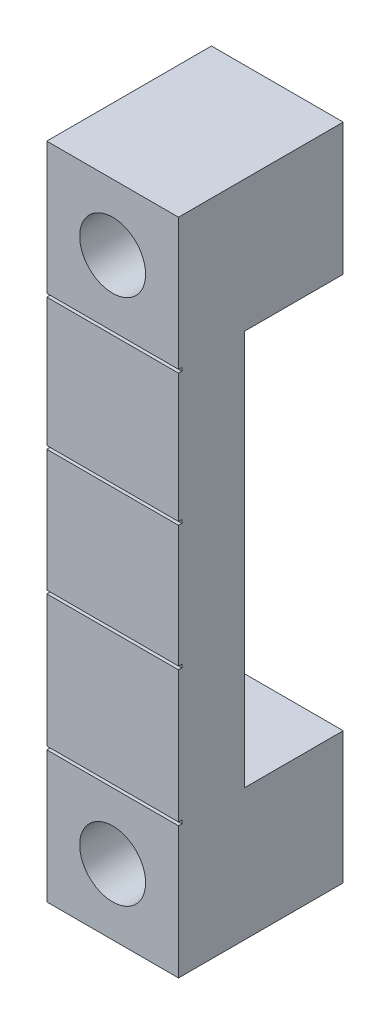
ISO-10303-21;
HEADER;
FILE_DESCRIPTION(('STEP AP214'),'2;1');
FILE_NAME('part.step','',(''),(''),'','','');
FILE_SCHEMA(('AUTOMOTIVE_DESIGN { 1 0 10303 214 1 1 1 1 }'));
ENDSEC;
DATA;
#1=APPLICATION_CONTEXT('core data for automotive mechanical design processes');
#2=APPLICATION_PROTOCOL_DEFINITION('international standard','automotive_design',2000,#1);
#3=PRODUCT_CONTEXT('',#1,'mechanical');
#4=PRODUCT('Part','Part','',(#3));
#5=PRODUCT_RELATED_PRODUCT_CATEGORY('part','',(#4));
#6=PRODUCT_DEFINITION_FORMATION('','',#4);
#7=PRODUCT_DEFINITION_CONTEXT('part definition',#1,'design');
#8=PRODUCT_DEFINITION('design','',#6,#7);
#9=PRODUCT_DEFINITION_SHAPE('','',#8);
#10=(LENGTH_UNIT() NAMED_UNIT(*) SI_UNIT(.MILLI.,.METRE.));
#11=(NAMED_UNIT(*) PLANE_ANGLE_UNIT() SI_UNIT($,.RADIAN.));
#12=(NAMED_UNIT(*) SI_UNIT($,.STERADIAN.) SOLID_ANGLE_UNIT());
#13=UNCERTAINTY_MEASURE_WITH_UNIT(LENGTH_MEASURE(1.E-05),#10,'distance_accuracy_value','');
#14=(GEOMETRIC_REPRESENTATION_CONTEXT(3) GLOBAL_UNCERTAINTY_ASSIGNED_CONTEXT((#13)) GLOBAL_UNIT_ASSIGNED_CONTEXT((#10,
#11,#12)) REPRESENTATION_CONTEXT('',''));
#15=CARTESIAN_POINT('',(0.,0.,0.));
#16=DIRECTION('',(0.,0.,1.));
#17=DIRECTION('',(1.,0.,0.));
#18=AXIS2_PLACEMENT_3D('',#15,#16,#17);
#19=CARTESIAN_POINT('',(0.,0.,10.));
#20=DIRECTION('',(0.,0.,1.));
#21=DIRECTION('',(1.,0.,0.));
#22=AXIS2_PLACEMENT_3D('',#19,#20,#21);
#23=PLANE('',#22);
#24=DIRECTION('',(-1.,0.,0.));
#25=VECTOR('',#24,1.);
#26=CARTESIAN_POINT('',(0.,-79.5,10.));
#27=LINE('',#26,#25);
#28=CARTESIAN_POINT('',(20.,-79.5,10.));
#29=VERTEX_POINT('',#28);
#30=CARTESIAN_POINT('',(0.,-79.5,10.));
#31=VERTEX_POINT('',#30);
#32=EDGE_CURVE('E218',#29,#31,#27,.T.);
#33=ORIENTED_EDGE('',*,*,#32,.F.);
#34=DIRECTION('',(0.,1.,0.));
#35=VECTOR('',#34,1.);
#36=CARTESIAN_POINT('',(20.,0.,10.));
#37=LINE('',#36,#35);
#38=CARTESIAN_POINT('',(20.,-59.5,10.));
#39=VERTEX_POINT('',#38);
#40=EDGE_CURVE('E373',#29,#39,#37,.T.);
#41=ORIENTED_EDGE('',*,*,#40,.T.);
#42=DIRECTION('',(1.,0.,0.));
#43=VECTOR('',#42,1.);
#44=CARTESIAN_POINT('',(0.,-59.5,10.));
#45=LINE('',#44,#43);
#46=CARTESIAN_POINT('',(0.,-59.5,10.));
#47=VERTEX_POINT('',#46);
#48=EDGE_CURVE('E242',#47,#39,#45,.T.);
#49=ORIENTED_EDGE('',*,*,#48,.F.);
#50=DIRECTION('',(0.,-1.,0.));
#51=VECTOR('',#50,1.);
#52=CARTESIAN_POINT('',(0.,0.,10.));
#53=LINE('',#52,#51);
#54=EDGE_CURVE('E726',#47,#31,#53,.T.);
#55=ORIENTED_EDGE('',*,*,#54,.T.);
#56=EDGE_LOOP('',(#33,#41,#49,#55));
#57=FACE_BOUND('',#56,.T.);
#58=ADVANCED_FACE('F41',(#57),#23,.T.);
#59=DIRECTION('',(-1.,0.,0.));
#60=VECTOR('',#59,1.);
#61=CARTESIAN_POINT('',(0.,-59.,10.));
#62=LINE('',#61,#60);
#63=CARTESIAN_POINT('',(20.,-59.,10.));
#64=VERTEX_POINT('',#63);
#65=CARTESIAN_POINT('',(0.,-59.,10.));
#66=VERTEX_POINT('',#65);
#67=EDGE_CURVE('E240',#64,#66,#62,.T.);
#68=ORIENTED_EDGE('',*,*,#67,.F.);
#69=CARTESIAN_POINT('',(20.,-40.5,10.));
#70=VERTEX_POINT('',#69);
#71=EDGE_CURVE('E751',#64,#70,#37,.T.);
#72=ORIENTED_EDGE('',*,*,#71,.T.);
#73=DIRECTION('',(1.,0.,0.));
#74=VECTOR('',#73,1.);
#75=CARTESIAN_POINT('',(0.,-40.5,10.));
#76=LINE('',#75,#74);
#77=CARTESIAN_POINT('',(0.,-40.5,10.));
#78=VERTEX_POINT('',#77);
#79=EDGE_CURVE('E239',#78,#70,#76,.T.);
#80=ORIENTED_EDGE('',*,*,#79,.F.);
#81=EDGE_CURVE('E728',#78,#66,#53,.T.);
#82=ORIENTED_EDGE('',*,*,#81,.T.);
#83=EDGE_LOOP('',(#68,#72,#80,#82));
#84=FACE_BOUND('',#83,.T.);
#85=ADVANCED_FACE('F411',(#84),#23,.T.);
#86=DIRECTION('',(-1.,0.,0.));
#87=VECTOR('',#86,1.);
#88=CARTESIAN_POINT('',(0.,-40.,10.));
#89=LINE('',#88,#87);
#90=CARTESIAN_POINT('',(20.,-40.,10.));
#91=VERTEX_POINT('',#90);
#92=CARTESIAN_POINT('',(0.,-40.,10.));
#93=VERTEX_POINT('',#92);
#94=EDGE_CURVE('E267',#91,#93,#89,.T.);
#95=ORIENTED_EDGE('',*,*,#94,.F.);
#96=CARTESIAN_POINT('',(20.,-20.5,10.));
#97=VERTEX_POINT('',#96);
#98=EDGE_CURVE('E749',#91,#97,#37,.T.);
#99=ORIENTED_EDGE('',*,*,#98,.T.);
#100=DIRECTION('',(1.,0.,0.));
#101=VECTOR('',#100,1.);
#102=CARTESIAN_POINT('',(0.,-20.5,10.));
#103=LINE('',#102,#101);
#104=CARTESIAN_POINT('',(0.,-20.5,10.));
#105=VERTEX_POINT('',#104);
#106=EDGE_CURVE('E266',#105,#97,#103,.T.);
#107=ORIENTED_EDGE('',*,*,#106,.F.);
#108=EDGE_CURVE('E366',#105,#93,#53,.T.);
#109=ORIENTED_EDGE('',*,*,#108,.T.);
#110=EDGE_LOOP('',(#95,#99,#107,#109));
#111=FACE_BOUND('',#110,.T.);
#112=ADVANCED_FACE('F405',(#111),#23,.T.);
#113=DIRECTION('',(-1.,0.,0.));
#114=VECTOR('',#113,1.);
#115=CARTESIAN_POINT('',(0.,-20.,10.));
#116=LINE('',#115,#114);
#117=CARTESIAN_POINT('',(20.,-20.,10.));
#118=VERTEX_POINT('',#117);
#119=CARTESIAN_POINT('',(0.,-20.,10.));
#120=VERTEX_POINT('',#119);
#121=EDGE_CURVE('E291',#118,#120,#116,.T.);
#122=ORIENTED_EDGE('',*,*,#121,.F.);
#123=CARTESIAN_POINT('',(20.,0.,10.));
#124=VERTEX_POINT('',#123);
#125=EDGE_CURVE('E368',#118,#124,#37,.T.);
#126=ORIENTED_EDGE('',*,*,#125,.T.);
#127=DIRECTION('',(-1.,0.,0.));
#128=VECTOR('',#127,1.);
#129=CARTESIAN_POINT('',(0.,0.,10.));
#130=LINE('',#129,#128);
#131=CARTESIAN_POINT('',(0.,0.,10.));
#132=VERTEX_POINT('',#131);
#133=EDGE_CURVE('E372',#124,#132,#130,.T.);
#134=ORIENTED_EDGE('',*,*,#133,.T.);
#135=EDGE_CURVE('E362',#132,#120,#53,.T.);
#136=ORIENTED_EDGE('',*,*,#135,.T.);
#137=EDGE_LOOP('',(#122,#126,#134,#136));
#138=FACE_BOUND('',#137,.T.);
#139=CARTESIAN_POINT('',(9.99999999999545,-9.99999999999545,10.));
#140=DIRECTION('',(0.,0.,1.));
#141=DIRECTION('',(1.,0.,0.));
#142=AXIS2_PLACEMENT_3D('',#139,#140,#141);
#143=CIRCLE('',#142,5.);
#144=CARTESIAN_POINT('',(14.9999999999955,-9.99999999999545,10.));
#145=VERTEX_POINT('',#144);
#146=EDGE_CURVE('E308',#145,#145,#143,.T.);
#147=ORIENTED_EDGE('',*,*,#146,.F.);
#148=EDGE_LOOP('',(#147));
#149=FACE_BOUND('',#148,.T.);
#150=ADVANCED_FACE('F394',(#138,#149),#23,.T.);
#151=CARTESIAN_POINT('',(9.99999999999999,-90.,10.));
#152=DIRECTION('',(0.,0.,-1.));
#153=DIRECTION('',(-1.,0.,0.));
#154=AXIS2_PLACEMENT_3D('',#151,#152,#153);
#155=CYLINDRICAL_SURFACE('',#154,3.);
#156=CARTESIAN_POINT('',(9.99999999999999,-90.,-15.));
#157=DIRECTION('',(0.,0.,-1.));
#158=DIRECTION('',(-1.,0.,0.));
#159=AXIS2_PLACEMENT_3D('',#156,#157,#158);
#160=CIRCLE('',#159,3.);
#161=CARTESIAN_POINT('',(6.99999999999999,-90.,-15.));
#162=VERTEX_POINT('',#161);
#163=EDGE_CURVE('E322',#162,#162,#160,.T.);
#164=ORIENTED_EDGE('',*,*,#163,.T.);
#165=EDGE_LOOP('',(#164));
#166=FACE_BOUND('',#165,.T.);
#167=CARTESIAN_POINT('',(9.99999999999999,-90.,-5.));
#168=DIRECTION('',(0.,0.,1.));
#169=DIRECTION('',(1.,0.,0.));
#170=AXIS2_PLACEMENT_3D('',#167,#168,#169);
#171=CIRCLE('',#170,3.);
#172=CARTESIAN_POINT('',(13.,-90.,-5.));
#173=VERTEX_POINT('',#172);
#174=EDGE_CURVE('E45',#173,#173,#171,.F.);
#175=ORIENTED_EDGE('',*,*,#174,.F.);
#176=EDGE_LOOP('',(#175));
#177=FACE_BOUND('',#176,.T.);
#178=ADVANCED_FACE('F391',(#166,#177),#155,.F.);
#179=CARTESIAN_POINT('',(9.99999999999545,-9.99999999999545,10.));
#180=DIRECTION('',(0.,0.,-1.));
#181=DIRECTION('',(-1.,0.,0.));
#182=AXIS2_PLACEMENT_3D('',#179,#180,#181);
#183=CYLINDRICAL_SURFACE('',#182,3.);
#184=CARTESIAN_POINT('',(9.99999999999545,-9.99999999999545,-15.));
#185=DIRECTION('',(0.,0.,-1.));
#186=DIRECTION('',(-1.,0.,0.));
#187=AXIS2_PLACEMENT_3D('',#184,#185,#186);
#188=CIRCLE('',#187,3.);
#189=CARTESIAN_POINT('',(6.99999999999545,-9.99999999999545,-15.));
#190=VERTEX_POINT('',#189);
#191=EDGE_CURVE('E318',#190,#190,#188,.T.);
#192=ORIENTED_EDGE('',*,*,#191,.T.);
#193=EDGE_LOOP('',(#192));
#194=FACE_BOUND('',#193,.T.);
#195=CARTESIAN_POINT('',(9.99999999999545,-9.99999999999545,-5.));
#196=DIRECTION('',(0.,0.,1.));
#197=DIRECTION('',(1.,0.,0.));
#198=AXIS2_PLACEMENT_3D('',#195,#196,#197);
#199=CIRCLE('',#198,3.);
#200=CARTESIAN_POINT('',(12.9999999999955,-9.99999999999545,-5.));
#201=VERTEX_POINT('',#200);
#202=EDGE_CURVE('E307',#201,#201,#199,.F.);
#203=ORIENTED_EDGE('',*,*,#202,.F.);
#204=EDGE_LOOP('',(#203));
#205=FACE_BOUND('',#204,.T.);
#206=ADVANCED_FACE('F393',(#194,#205),#183,.F.);
#207=CARTESIAN_POINT('',(0.,0.,0.));
#208=DIRECTION('',(0.,0.,1.));
#209=DIRECTION('',(1.,0.,0.));
#210=AXIS2_PLACEMENT_3D('',#207,#208,#209);
#211=PLANE('',#210);
#212=DIRECTION('',(1.,0.,0.));
#213=VECTOR('',#212,1.);
#214=CARTESIAN_POINT('',(0.,-80.,0.));
#215=LINE('',#214,#213);
#216=CARTESIAN_POINT('',(0.,-80.,0.));
#217=VERTEX_POINT('',#216);
#218=CARTESIAN_POINT('',(20.,-80.,0.));
#219=VERTEX_POINT('',#218);
#220=EDGE_CURVE('E329',#217,#219,#215,.T.);
#221=ORIENTED_EDGE('',*,*,#220,.F.);
#222=DIRECTION('',(0.,-1.,0.));
#223=VECTOR('',#222,1.);
#224=CARTESIAN_POINT('',(0.,0.,0.));
#225=LINE('',#224,#223);
#226=CARTESIAN_POINT('',(0.,-20.,0.));
#227=VERTEX_POINT('',#226);
#228=EDGE_CURVE('E361',#227,#217,#225,.T.);
#229=ORIENTED_EDGE('',*,*,#228,.F.);
#230=DIRECTION('',(-1.,0.,0.));
#231=VECTOR('',#230,1.);
#232=CARTESIAN_POINT('',(0.,-20.,0.));
#233=LINE('',#232,#231);
#234=CARTESIAN_POINT('',(20.,-20.,0.));
#235=VERTEX_POINT('',#234);
#236=EDGE_CURVE('E332',#235,#227,#233,.T.);
#237=ORIENTED_EDGE('',*,*,#236,.F.);
#238=DIRECTION('',(0.,1.,0.));
#239=VECTOR('',#238,1.);
#240=CARTESIAN_POINT('',(20.,0.,0.));
#241=LINE('',#240,#239);
#242=EDGE_CURVE('E378',#219,#235,#241,.T.);
#243=ORIENTED_EDGE('',*,*,#242,.F.);
#244=EDGE_LOOP('',(#221,#229,#237,#243));
#245=FACE_BOUND('',#244,.T.);
#246=ADVANCED_FACE('F401',(#245),#211,.F.);
#247=CARTESIAN_POINT('',(0.,0.,10.));
#248=DIRECTION('',(1.,0.,0.));
#249=DIRECTION('',(0.,1.,0.));
#250=AXIS2_PLACEMENT_3D('',#247,#248,#249);
#251=PLANE('',#250);
#252=DIRECTION('',(0.,-1.,0.));
#253=VECTOR('',#252,1.);
#254=CARTESIAN_POINT('',(0.,-80.,9.5));
#255=LINE('',#254,#253);
#256=CARTESIAN_POINT('',(0.,-79.5,9.5));
#257=VERTEX_POINT('',#256);
#258=CARTESIAN_POINT('',(0.,-80.,9.5));
#259=VERTEX_POINT('',#258);
#260=EDGE_CURVE('E209',#257,#259,#255,.T.);
#261=ORIENTED_EDGE('',*,*,#260,.F.);
#262=DIRECTION('',(0.,0.,1.));
#263=VECTOR('',#262,1.);
#264=CARTESIAN_POINT('',(0.,-79.5,9.5));
#265=LINE('',#264,#263);
#266=EDGE_CURVE('E317',#257,#31,#265,.T.);
#267=ORIENTED_EDGE('',*,*,#266,.T.);
#268=ORIENTED_EDGE('',*,*,#54,.F.);
#269=DIRECTION('',(0.,0.,1.));
#270=VECTOR('',#269,1.);
#271=CARTESIAN_POINT('',(0.,-59.5,9.5));
#272=LINE('',#271,#270);
#273=CARTESIAN_POINT('',(0.,-59.5,9.5));
#274=VERTEX_POINT('',#273);
#275=EDGE_CURVE('E66',#274,#47,#272,.T.);
#276=ORIENTED_EDGE('',*,*,#275,.F.);
#277=DIRECTION('',(0.,-1.,0.));
#278=VECTOR('',#277,1.);
#279=CARTESIAN_POINT('',(0.,-59.5,9.5));
#280=LINE('',#279,#278);
#281=CARTESIAN_POINT('',(0.,-59.,9.5));
#282=VERTEX_POINT('',#281);
#283=EDGE_CURVE('E243',#282,#274,#280,.T.);
#284=ORIENTED_EDGE('',*,*,#283,.F.);
#285=DIRECTION('',(0.,0.,1.));
#286=VECTOR('',#285,1.);
#287=CARTESIAN_POINT('',(0.,-59.,9.5));
#288=LINE('',#287,#286);
#289=EDGE_CURVE('E236',#282,#66,#288,.T.);
#290=ORIENTED_EDGE('',*,*,#289,.T.);
#291=ORIENTED_EDGE('',*,*,#81,.F.);
#292=DIRECTION('',(0.,0.,1.));
#293=VECTOR('',#292,1.);
#294=CARTESIAN_POINT('',(0.,-40.5,9.5));
#295=LINE('',#294,#293);
#296=CARTESIAN_POINT('',(0.,-40.5,9.5));
#297=VERTEX_POINT('',#296);
#298=EDGE_CURVE('E255',#297,#78,#295,.T.);
#299=ORIENTED_EDGE('',*,*,#298,.F.);
#300=DIRECTION('',(0.,-1.,0.));
#301=VECTOR('',#300,1.);
#302=CARTESIAN_POINT('',(0.,-40.,9.5));
#303=LINE('',#302,#301);
#304=CARTESIAN_POINT('',(0.,-40.,9.5));
#305=VERTEX_POINT('',#304);
#306=EDGE_CURVE('E269',#305,#297,#303,.T.);
#307=ORIENTED_EDGE('',*,*,#306,.F.);
#308=DIRECTION('',(0.,0.,1.));
#309=VECTOR('',#308,1.);
#310=CARTESIAN_POINT('',(0.,-40.,9.5));
#311=LINE('',#310,#309);
#312=EDGE_CURVE('E263',#305,#93,#311,.T.);
#313=ORIENTED_EDGE('',*,*,#312,.T.);
#314=ORIENTED_EDGE('',*,*,#108,.F.);
#315=DIRECTION('',(0.,0.,1.));
#316=VECTOR('',#315,1.);
#317=CARTESIAN_POINT('',(0.,-20.5,9.5));
#318=LINE('',#317,#316);
#319=CARTESIAN_POINT('',(0.,-20.5,9.5));
#320=VERTEX_POINT('',#319);
#321=EDGE_CURVE('E280',#320,#105,#318,.T.);
#322=ORIENTED_EDGE('',*,*,#321,.F.);
#323=DIRECTION('',(0.,-1.,0.));
#324=VECTOR('',#323,1.);
#325=CARTESIAN_POINT('',(0.,-20.5,9.5));
#326=LINE('',#325,#324);
#327=CARTESIAN_POINT('',(0.,-20.,9.5));
#328=VERTEX_POINT('',#327);
#329=EDGE_CURVE('E293',#328,#320,#326,.T.);
#330=ORIENTED_EDGE('',*,*,#329,.F.);
#331=DIRECTION('',(0.,0.,1.));
#332=VECTOR('',#331,1.);
#333=CARTESIAN_POINT('',(0.,-20.,9.5));
#334=LINE('',#333,#332);
#335=EDGE_CURVE('E288',#328,#120,#334,.T.);
#336=ORIENTED_EDGE('',*,*,#335,.T.);
#337=ORIENTED_EDGE('',*,*,#135,.F.);
#338=DIRECTION('',(0.,0.,-1.));
#339=VECTOR('',#338,1.);
#340=CARTESIAN_POINT('',(0.,0.,10.));
#341=LINE('',#340,#339);
#342=CARTESIAN_POINT('',(0.,0.,-15.));
#343=VERTEX_POINT('',#342);
#344=EDGE_CURVE('E375',#132,#343,#341,.T.);
#345=ORIENTED_EDGE('',*,*,#344,.T.);
#346=DIRECTION('',(0.,1.,0.));
#347=VECTOR('',#346,1.);
#348=CARTESIAN_POINT('',(0.,0.,-15.));
#349=LINE('',#348,#347);
#350=CARTESIAN_POINT('',(0.,-20.,-15.));
#351=VERTEX_POINT('',#350);
#352=EDGE_CURVE('E343',#351,#343,#349,.T.);
#353=ORIENTED_EDGE('',*,*,#352,.F.);
#354=DIRECTION('',(0.,0.,1.));
#355=VECTOR('',#354,1.);
#356=CARTESIAN_POINT('',(0.,-20.,-15.));
#357=LINE('',#356,#355);
#358=EDGE_CURVE('E353',#351,#227,#357,.T.);
#359=ORIENTED_EDGE('',*,*,#358,.T.);
#360=ORIENTED_EDGE('',*,*,#228,.T.);
#361=DIRECTION('',(0.,0.,1.));
#362=VECTOR('',#361,1.);
#363=CARTESIAN_POINT('',(0.,-80.,-15.));
#364=LINE('',#363,#362);
#365=CARTESIAN_POINT('',(0.,-80.,-15.));
#366=VERTEX_POINT('',#365);
#367=EDGE_CURVE('E321',#366,#217,#364,.T.);
#368=ORIENTED_EDGE('',*,*,#367,.F.);
#369=DIRECTION('',(0.,1.,0.));
#370=VECTOR('',#369,1.);
#371=CARTESIAN_POINT('',(0.,-100.,-15.));
#372=LINE('',#371,#370);
#373=CARTESIAN_POINT('',(0.,-100.,-15.));
#374=VERTEX_POINT('',#373);
#375=EDGE_CURVE('E333',#374,#366,#372,.T.);
#376=ORIENTED_EDGE('',*,*,#375,.F.);
#377=DIRECTION('',(0.,0.,-1.));
#378=VECTOR('',#377,1.);
#379=CARTESIAN_POINT('',(0.,-100.,10.));
#380=LINE('',#379,#378);
#381=CARTESIAN_POINT('',(0.,-100.,10.));
#382=VERTEX_POINT('',#381);
#383=EDGE_CURVE('E11',#382,#374,#380,.T.);
#384=ORIENTED_EDGE('',*,*,#383,.F.);
#385=CARTESIAN_POINT('',(0.,-80.,10.));
#386=VERTEX_POINT('',#385);
#387=EDGE_CURVE('E222',#386,#382,#53,.T.);
#388=ORIENTED_EDGE('',*,*,#387,.F.);
#389=DIRECTION('',(0.,0.,1.));
#390=VECTOR('',#389,1.);
#391=CARTESIAN_POINT('',(0.,-80.,9.5));
#392=LINE('',#391,#390);
#393=EDGE_CURVE('E58',#259,#386,#392,.T.);
#394=ORIENTED_EDGE('',*,*,#393,.F.);
#395=EDGE_LOOP('',(#261,#267,#268,#276,#284,#290,#291,#299,#307,#313,#314,#322,#330,#336,#337,
#345,#353,#359,#360,#368,#376,#384,#388,#394));
#396=FACE_BOUND('',#395,.T.);
#397=ADVANCED_FACE('F43',(#396),#251,.F.);
#398=CARTESIAN_POINT('',(0.,-100.,10.));
#399=DIRECTION('',(0.,1.,0.));
#400=DIRECTION('',(0.,0.,1.));
#401=AXIS2_PLACEMENT_3D('',#398,#399,#400);
#402=PLANE('',#401);
#403=ORIENTED_EDGE('',*,*,#383,.T.);
#404=DIRECTION('',(-1.,0.,0.));
#405=VECTOR('',#404,1.);
#406=CARTESIAN_POINT('',(0.,-100.,-15.));
#407=LINE('',#406,#405);
#408=CARTESIAN_POINT('',(20.,-100.,-15.));
#409=VERTEX_POINT('',#408);
#410=EDGE_CURVE('E328',#409,#374,#407,.T.);
#411=ORIENTED_EDGE('',*,*,#410,.F.);
#412=DIRECTION('',(0.,0.,-1.));
#413=VECTOR('',#412,1.);
#414=CARTESIAN_POINT('',(20.,-100.,10.));
#415=LINE('',#414,#413);
#416=CARTESIAN_POINT('',(20.,-100.,10.));
#417=VERTEX_POINT('',#416);
#418=EDGE_CURVE('E50',#417,#409,#415,.T.);
#419=ORIENTED_EDGE('',*,*,#418,.F.);
#420=DIRECTION('',(1.,0.,0.));
#421=VECTOR('',#420,1.);
#422=CARTESIAN_POINT('',(0.,-100.,10.));
#423=LINE('',#422,#421);
#424=EDGE_CURVE('E365',#382,#417,#423,.T.);
#425=ORIENTED_EDGE('',*,*,#424,.F.);
#426=EDGE_LOOP('',(#403,#411,#419,#425));
#427=FACE_BOUND('',#426,.T.);
#428=ADVANCED_FACE('F659',(#427),#402,.F.);
#429=CARTESIAN_POINT('',(20.,0.,10.));
#430=DIRECTION('',(-1.,0.,0.));
#431=DIRECTION('',(0.,-1.,0.));
#432=AXIS2_PLACEMENT_3D('',#429,#430,#431);
#433=PLANE('',#432);
#434=ORIENTED_EDGE('',*,*,#40,.F.);
#435=DIRECTION('',(0.,0.,1.));
#436=VECTOR('',#435,1.);
#437=CARTESIAN_POINT('',(20.,-79.5,9.5));
#438=LINE('',#437,#436);
#439=CARTESIAN_POINT('',(20.,-79.5,9.5));
#440=VERTEX_POINT('',#439);
#441=EDGE_CURVE('E224',#440,#29,#438,.T.);
#442=ORIENTED_EDGE('',*,*,#441,.F.);
#443=DIRECTION('',(0.,1.,0.));
#444=VECTOR('',#443,1.);
#445=CARTESIAN_POINT('',(20.,-80.,9.5));
#446=LINE('',#445,#444);
#447=CARTESIAN_POINT('',(20.,-80.,9.5));
#448=VERTEX_POINT('',#447);
#449=EDGE_CURVE('E208',#448,#440,#446,.T.);
#450=ORIENTED_EDGE('',*,*,#449,.F.);
#451=DIRECTION('',(0.,0.,1.));
#452=VECTOR('',#451,1.);
#453=CARTESIAN_POINT('',(20.,-80.,9.5));
#454=LINE('',#453,#452);
#455=CARTESIAN_POINT('',(20.,-80.,10.));
#456=VERTEX_POINT('',#455);
#457=EDGE_CURVE('E205',#448,#456,#454,.T.);
#458=ORIENTED_EDGE('',*,*,#457,.T.);
#459=EDGE_CURVE('E369',#417,#456,#37,.T.);
#460=ORIENTED_EDGE('',*,*,#459,.F.);
#461=ORIENTED_EDGE('',*,*,#418,.T.);
#462=DIRECTION('',(0.,-1.,0.));
#463=VECTOR('',#462,1.);
#464=CARTESIAN_POINT('',(20.,-100.,-15.));
#465=LINE('',#464,#463);
#466=CARTESIAN_POINT('',(20.,-80.,-15.));
#467=VERTEX_POINT('',#466);
#468=EDGE_CURVE('E336',#467,#409,#465,.T.);
#469=ORIENTED_EDGE('',*,*,#468,.F.);
#470=DIRECTION('',(0.,0.,1.));
#471=VECTOR('',#470,1.);
#472=CARTESIAN_POINT('',(20.,-80.,-15.));
#473=LINE('',#472,#471);
#474=EDGE_CURVE('E326',#467,#219,#473,.T.);
#475=ORIENTED_EDGE('',*,*,#474,.T.);
#476=ORIENTED_EDGE('',*,*,#242,.T.);
#477=DIRECTION('',(0.,0.,1.));
#478=VECTOR('',#477,1.);
#479=CARTESIAN_POINT('',(20.,-20.,-15.));
#480=LINE('',#479,#478);
#481=CARTESIAN_POINT('',(20.,-20.,-15.));
#482=VERTEX_POINT('',#481);
#483=EDGE_CURVE('E358',#482,#235,#480,.T.);
#484=ORIENTED_EDGE('',*,*,#483,.F.);
#485=DIRECTION('',(0.,-1.,0.));
#486=VECTOR('',#485,1.);
#487=CARTESIAN_POINT('',(20.,0.,-15.));
#488=LINE('',#487,#486);
#489=CARTESIAN_POINT('',(20.,0.,-15.));
#490=VERTEX_POINT('',#489);
#491=EDGE_CURVE('E349',#490,#482,#488,.T.);
#492=ORIENTED_EDGE('',*,*,#491,.F.);
#493=DIRECTION('',(0.,0.,-1.));
#494=VECTOR('',#493,1.);
#495=CARTESIAN_POINT('',(20.,0.,10.));
#496=LINE('',#495,#494);
#497=EDGE_CURVE('E381',#124,#490,#496,.T.);
#498=ORIENTED_EDGE('',*,*,#497,.F.);
#499=ORIENTED_EDGE('',*,*,#125,.F.);
#500=DIRECTION('',(0.,0.,1.));
#501=VECTOR('',#500,1.);
#502=CARTESIAN_POINT('',(20.,-20.,9.5));
#503=LINE('',#502,#501);
#504=CARTESIAN_POINT('',(20.,-20.,9.5));
#505=VERTEX_POINT('',#504);
#506=EDGE_CURVE('E286',#505,#118,#503,.T.);
#507=ORIENTED_EDGE('',*,*,#506,.F.);
#508=DIRECTION('',(0.,1.,0.));
#509=VECTOR('',#508,1.);
#510=CARTESIAN_POINT('',(20.,-20.5,9.5));
#511=LINE('',#510,#509);
#512=CARTESIAN_POINT('',(20.,-20.5,9.5));
#513=VERTEX_POINT('',#512);
#514=EDGE_CURVE('E297',#513,#505,#511,.T.);
#515=ORIENTED_EDGE('',*,*,#514,.F.);
#516=DIRECTION('',(0.,0.,1.));
#517=VECTOR('',#516,1.);
#518=CARTESIAN_POINT('',(20.,-20.5,9.5));
#519=LINE('',#518,#517);
#520=EDGE_CURVE('E283',#513,#97,#519,.T.);
#521=ORIENTED_EDGE('',*,*,#520,.T.);
#522=ORIENTED_EDGE('',*,*,#98,.F.);
#523=DIRECTION('',(0.,0.,1.));
#524=VECTOR('',#523,1.);
#525=CARTESIAN_POINT('',(20.,-40.,9.5));
#526=LINE('',#525,#524);
#527=CARTESIAN_POINT('',(20.,-40.,9.5));
#528=VERTEX_POINT('',#527);
#529=EDGE_CURVE('E261',#528,#91,#526,.T.);
#530=ORIENTED_EDGE('',*,*,#529,.F.);
#531=DIRECTION('',(0.,1.,0.));
#532=VECTOR('',#531,1.);
#533=CARTESIAN_POINT('',(20.,-40.,9.5));
#534=LINE('',#533,#532);
#535=CARTESIAN_POINT('',(20.,-40.5,9.5));
#536=VERTEX_POINT('',#535);
#537=EDGE_CURVE('E273',#536,#528,#534,.T.);
#538=ORIENTED_EDGE('',*,*,#537,.F.);
#539=DIRECTION('',(0.,0.,1.));
#540=VECTOR('',#539,1.);
#541=CARTESIAN_POINT('',(20.,-40.5,9.5));
#542=LINE('',#541,#540);
#543=EDGE_CURVE('E258',#536,#70,#542,.T.);
#544=ORIENTED_EDGE('',*,*,#543,.T.);
#545=ORIENTED_EDGE('',*,*,#71,.F.);
#546=DIRECTION('',(0.,0.,1.));
#547=VECTOR('',#546,1.);
#548=CARTESIAN_POINT('',(20.,-59.,9.5));
#549=LINE('',#548,#547);
#550=CARTESIAN_POINT('',(20.,-59.,9.5));
#551=VERTEX_POINT('',#550);
#552=EDGE_CURVE('E234',#551,#64,#549,.T.);
#553=ORIENTED_EDGE('',*,*,#552,.F.);
#554=DIRECTION('',(0.,1.,0.));
#555=VECTOR('',#554,1.);
#556=CARTESIAN_POINT('',(20.,-59.5,9.5));
#557=LINE('',#556,#555);
#558=CARTESIAN_POINT('',(20.,-59.5,9.5));
#559=VERTEX_POINT('',#558);
#560=EDGE_CURVE('E248',#559,#551,#557,.T.);
#561=ORIENTED_EDGE('',*,*,#560,.F.);
#562=DIRECTION('',(0.,0.,1.));
#563=VECTOR('',#562,1.);
#564=CARTESIAN_POINT('',(20.,-59.5,9.5));
#565=LINE('',#564,#563);
#566=EDGE_CURVE('E231',#559,#39,#565,.T.);
#567=ORIENTED_EDGE('',*,*,#566,.T.);
#568=EDGE_LOOP('',(#434,#442,#450,#458,#460,#461,#469,#475,#476,#484,#492,#498,#499,#507,#515,
#521,#522,#530,#538,#544,#545,#553,#561,#567));
#569=FACE_BOUND('',#568,.T.);
#570=ADVANCED_FACE('F433',(#569),#433,.F.);
#571=CARTESIAN_POINT('',(0.,0.,10.));
#572=DIRECTION('',(0.,-1.,0.));
#573=DIRECTION('',(0.,0.,-1.));
#574=AXIS2_PLACEMENT_3D('',#571,#572,#573);
#575=PLANE('',#574);
#576=ORIENTED_EDGE('',*,*,#497,.T.);
#577=DIRECTION('',(1.,0.,0.));
#578=VECTOR('',#577,1.);
#579=CARTESIAN_POINT('',(0.,0.,-15.));
#580=LINE('',#579,#578);
#581=EDGE_CURVE('E346',#343,#490,#580,.T.);
#582=ORIENTED_EDGE('',*,*,#581,.F.);
#583=ORIENTED_EDGE('',*,*,#344,.F.);
#584=ORIENTED_EDGE('',*,*,#133,.F.);
#585=EDGE_LOOP('',(#576,#582,#583,#584));
#586=FACE_BOUND('',#585,.T.);
#587=ADVANCED_FACE('F423',(#586),#575,.F.);
#588=DIRECTION('',(1.,0.,0.));
#589=VECTOR('',#588,1.);
#590=CARTESIAN_POINT('',(0.,-80.,10.));
#591=LINE('',#590,#589);
#592=EDGE_CURVE('E245',#386,#456,#591,.T.);
#593=ORIENTED_EDGE('',*,*,#592,.F.);
#594=ORIENTED_EDGE('',*,*,#387,.T.);
#595=ORIENTED_EDGE('',*,*,#424,.T.);
#596=ORIENTED_EDGE('',*,*,#459,.T.);
#597=EDGE_LOOP('',(#593,#594,#595,#596));
#598=FACE_BOUND('',#597,.T.);
#599=CARTESIAN_POINT('',(9.99999999999999,-90.,10.));
#600=DIRECTION('',(0.,0.,1.));
#601=DIRECTION('',(1.,0.,0.));
#602=AXIS2_PLACEMENT_3D('',#599,#600,#601);
#603=CIRCLE('',#602,5.);
#604=CARTESIAN_POINT('',(15.,-90.,10.));
#605=VERTEX_POINT('',#604);
#606=EDGE_CURVE('E311',#605,#605,#603,.T.);
#607=ORIENTED_EDGE('',*,*,#606,.F.);
#608=EDGE_LOOP('',(#607));
#609=FACE_BOUND('',#608,.T.);
#610=ADVANCED_FACE('F408',(#598,#609),#23,.T.);
#611=CARTESIAN_POINT('',(0.,-20.,-15.));
#612=DIRECTION('',(0.,1.,0.));
#613=DIRECTION('',(-1.,0.,0.));
#614=AXIS2_PLACEMENT_3D('',#611,#612,#613);
#615=PLANE('',#614);
#616=ORIENTED_EDGE('',*,*,#236,.T.);
#617=ORIENTED_EDGE('',*,*,#358,.F.);
#618=DIRECTION('',(-1.,0.,0.));
#619=VECTOR('',#618,1.);
#620=CARTESIAN_POINT('',(0.,-20.,-15.));
#621=LINE('',#620,#619);
#622=EDGE_CURVE('E351',#482,#351,#621,.T.);
#623=ORIENTED_EDGE('',*,*,#622,.F.);
#624=ORIENTED_EDGE('',*,*,#483,.T.);
#625=EDGE_LOOP('',(#616,#617,#623,#624));
#626=FACE_BOUND('',#625,.T.);
#627=ADVANCED_FACE('F422',(#626),#615,.F.);
#628=CARTESIAN_POINT('',(0.,0.,-15.));
#629=DIRECTION('',(0.,0.,1.));
#630=DIRECTION('',(1.,0.,0.));
#631=AXIS2_PLACEMENT_3D('',#628,#629,#630);
#632=PLANE('',#631);
#633=ORIENTED_EDGE('',*,*,#191,.F.);
#634=EDGE_LOOP('',(#633));
#635=FACE_BOUND('',#634,.T.);
#636=ORIENTED_EDGE('',*,*,#352,.T.);
#637=ORIENTED_EDGE('',*,*,#581,.T.);
#638=ORIENTED_EDGE('',*,*,#491,.T.);
#639=ORIENTED_EDGE('',*,*,#622,.T.);
#640=EDGE_LOOP('',(#636,#637,#638,#639));
#641=FACE_BOUND('',#640,.T.);
#642=ADVANCED_FACE('F430',(#635,#641),#632,.F.);
#643=CARTESIAN_POINT('',(0.,-80.,-15.));
#644=DIRECTION('',(0.,-1.,0.));
#645=DIRECTION('',(0.,0.,-1.));
#646=AXIS2_PLACEMENT_3D('',#643,#644,#645);
#647=PLANE('',#646);
#648=ORIENTED_EDGE('',*,*,#220,.T.);
#649=ORIENTED_EDGE('',*,*,#474,.F.);
#650=DIRECTION('',(1.,0.,0.));
#651=VECTOR('',#650,1.);
#652=CARTESIAN_POINT('',(0.,-80.,-15.));
#653=LINE('',#652,#651);
#654=EDGE_CURVE('E339',#366,#467,#653,.T.);
#655=ORIENTED_EDGE('',*,*,#654,.F.);
#656=ORIENTED_EDGE('',*,*,#367,.T.);
#657=EDGE_LOOP('',(#648,#649,#655,#656));
#658=FACE_BOUND('',#657,.T.);
#659=ADVANCED_FACE('F617',(#658),#647,.F.);
#660=CARTESIAN_POINT('',(0.,0.,-15.));
#661=DIRECTION('',(0.,0.,-1.));
#662=DIRECTION('',(-1.,0.,0.));
#663=AXIS2_PLACEMENT_3D('',#660,#661,#662);
#664=PLANE('',#663);
#665=ORIENTED_EDGE('',*,*,#163,.F.);
#666=EDGE_LOOP('',(#665));
#667=FACE_BOUND('',#666,.T.);
#668=ORIENTED_EDGE('',*,*,#375,.T.);
#669=ORIENTED_EDGE('',*,*,#654,.T.);
#670=ORIENTED_EDGE('',*,*,#468,.T.);
#671=ORIENTED_EDGE('',*,*,#410,.T.);
#672=EDGE_LOOP('',(#668,#669,#670,#671));
#673=FACE_BOUND('',#672,.T.);
#674=ADVANCED_FACE('F460',(#667,#673),#664,.T.);
#675=CARTESIAN_POINT('',(9.99999999999545,-9.99999999999545,-5.));
#676=DIRECTION('',(0.,0.,1.));
#677=DIRECTION('',(1.,0.,0.));
#678=AXIS2_PLACEMENT_3D('',#675,#676,#677);
#679=PLANE('',#678);
#680=CARTESIAN_POINT('',(9.99999999999545,-9.99999999999545,-5.));
#681=DIRECTION('',(0.,0.,1.));
#682=DIRECTION('',(1.,0.,0.));
#683=AXIS2_PLACEMENT_3D('',#680,#681,#682);
#684=CIRCLE('',#683,5.);
#685=CARTESIAN_POINT('',(14.9999999999955,-9.99999999999545,-5.));
#686=VERTEX_POINT('',#685);
#687=EDGE_CURVE('E304',#686,#686,#684,.T.);
#688=ORIENTED_EDGE('',*,*,#687,.T.);
#689=EDGE_LOOP('',(#688));
#690=FACE_BOUND('',#689,.T.);
#691=ORIENTED_EDGE('',*,*,#202,.T.);
#692=EDGE_LOOP('',(#691));
#693=FACE_BOUND('',#692,.T.);
#694=ADVANCED_FACE('F456',(#690,#693),#679,.T.);
#695=CARTESIAN_POINT('',(9.99999999999545,-9.99999999999545,-5.));
#696=DIRECTION('',(0.,0.,1.));
#697=DIRECTION('',(1.,0.,0.));
#698=AXIS2_PLACEMENT_3D('',#695,#696,#697);
#699=CYLINDRICAL_SURFACE('',#698,5.);
#700=ORIENTED_EDGE('',*,*,#687,.F.);
#701=EDGE_LOOP('',(#700));
#702=FACE_BOUND('',#701,.T.);
#703=ORIENTED_EDGE('',*,*,#146,.T.);
#704=EDGE_LOOP('',(#703));
#705=FACE_BOUND('',#704,.T.);
#706=ADVANCED_FACE('F449',(#702,#705),#699,.F.);
#707=CARTESIAN_POINT('',(9.99999999999999,-90.,-5.));
#708=DIRECTION('',(0.,0.,1.));
#709=DIRECTION('',(1.,0.,0.));
#710=AXIS2_PLACEMENT_3D('',#707,#708,#709);
#711=PLANE('',#710);
#712=CARTESIAN_POINT('',(9.99999999999999,-90.,-5.));
#713=DIRECTION('',(0.,0.,1.));
#714=DIRECTION('',(1.,0.,0.));
#715=AXIS2_PLACEMENT_3D('',#712,#713,#714);
#716=CIRCLE('',#715,5.);
#717=CARTESIAN_POINT('',(15.,-90.,-5.));
#718=VERTEX_POINT('',#717);
#719=EDGE_CURVE('E314',#718,#718,#716,.T.);
#720=ORIENTED_EDGE('',*,*,#719,.T.);
#721=EDGE_LOOP('',(#720));
#722=FACE_BOUND('',#721,.T.);
#723=ORIENTED_EDGE('',*,*,#174,.T.);
#724=EDGE_LOOP('',(#723));
#725=FACE_BOUND('',#724,.T.);
#726=ADVANCED_FACE('F389',(#722,#725),#711,.T.);
#727=CARTESIAN_POINT('',(9.99999999999999,-90.,-5.));
#728=DIRECTION('',(0.,0.,1.));
#729=DIRECTION('',(1.,0.,0.));
#730=AXIS2_PLACEMENT_3D('',#727,#728,#729);
#731=CYLINDRICAL_SURFACE('',#730,5.);
#732=ORIENTED_EDGE('',*,*,#719,.F.);
#733=EDGE_LOOP('',(#732));
#734=FACE_BOUND('',#733,.T.);
#735=ORIENTED_EDGE('',*,*,#606,.T.);
#736=EDGE_LOOP('',(#735));
#737=FACE_BOUND('',#736,.T.);
#738=ADVANCED_FACE('F439',(#734,#737),#731,.F.);
#739=CARTESIAN_POINT('',(0.,-20.,9.5));
#740=DIRECTION('',(0.,1.,0.));
#741=DIRECTION('',(-1.,0.,0.));
#742=AXIS2_PLACEMENT_3D('',#739,#740,#741);
#743=PLANE('',#742);
#744=ORIENTED_EDGE('',*,*,#121,.T.);
#745=ORIENTED_EDGE('',*,*,#335,.F.);
#746=DIRECTION('',(-1.,0.,0.));
#747=VECTOR('',#746,1.);
#748=CARTESIAN_POINT('',(0.,-20.,9.5));
#749=LINE('',#748,#747);
#750=EDGE_CURVE('E282',#505,#328,#749,.T.);
#751=ORIENTED_EDGE('',*,*,#750,.F.);
#752=ORIENTED_EDGE('',*,*,#506,.T.);
#753=EDGE_LOOP('',(#744,#745,#751,#752));
#754=FACE_BOUND('',#753,.T.);
#755=ADVANCED_FACE('F440',(#754),#743,.F.);
#756=CARTESIAN_POINT('',(0.,-20.5,9.5));
#757=DIRECTION('',(0.,-1.,0.));
#758=DIRECTION('',(0.,0.,-1.));
#759=AXIS2_PLACEMENT_3D('',#756,#757,#758);
#760=PLANE('',#759);
#761=ORIENTED_EDGE('',*,*,#106,.T.);
#762=ORIENTED_EDGE('',*,*,#520,.F.);
#763=DIRECTION('',(1.,0.,0.));
#764=VECTOR('',#763,1.);
#765=CARTESIAN_POINT('',(0.,-20.5,9.5));
#766=LINE('',#765,#764);
#767=EDGE_CURVE('E299',#320,#513,#766,.T.);
#768=ORIENTED_EDGE('',*,*,#767,.F.);
#769=ORIENTED_EDGE('',*,*,#321,.T.);
#770=EDGE_LOOP('',(#761,#762,#768,#769));
#771=FACE_BOUND('',#770,.T.);
#772=ADVANCED_FACE('F446',(#771),#760,.F.);
#773=CARTESIAN_POINT('',(0.,0.,9.5));
#774=DIRECTION('',(0.,0.,-1.));
#775=DIRECTION('',(-1.,0.,0.));
#776=AXIS2_PLACEMENT_3D('',#773,#774,#775);
#777=PLANE('',#776);
#778=ORIENTED_EDGE('',*,*,#329,.T.);
#779=ORIENTED_EDGE('',*,*,#767,.T.);
#780=ORIENTED_EDGE('',*,*,#514,.T.);
#781=ORIENTED_EDGE('',*,*,#750,.T.);
#782=EDGE_LOOP('',(#778,#779,#780,#781));
#783=FACE_BOUND('',#782,.T.);
#784=ADVANCED_FACE('F462',(#783),#777,.F.);
#785=CARTESIAN_POINT('',(0.,-40.,9.5));
#786=DIRECTION('',(0.,1.,0.));
#787=DIRECTION('',(0.,0.,1.));
#788=AXIS2_PLACEMENT_3D('',#785,#786,#787);
#789=PLANE('',#788);
#790=ORIENTED_EDGE('',*,*,#94,.T.);
#791=ORIENTED_EDGE('',*,*,#312,.F.);
#792=DIRECTION('',(-1.,0.,0.));
#793=VECTOR('',#792,1.);
#794=CARTESIAN_POINT('',(0.,-40.,9.5));
#795=LINE('',#794,#793);
#796=EDGE_CURVE('E257',#528,#305,#795,.T.);
#797=ORIENTED_EDGE('',*,*,#796,.F.);
#798=ORIENTED_EDGE('',*,*,#529,.T.);
#799=EDGE_LOOP('',(#790,#791,#797,#798));
#800=FACE_BOUND('',#799,.T.);
#801=ADVANCED_FACE('F464',(#800),#789,.F.);
#802=CARTESIAN_POINT('',(0.,-40.5,9.5));
#803=DIRECTION('',(0.,-1.,0.));
#804=DIRECTION('',(0.,0.,-1.));
#805=AXIS2_PLACEMENT_3D('',#802,#803,#804);
#806=PLANE('',#805);
#807=ORIENTED_EDGE('',*,*,#79,.T.);
#808=ORIENTED_EDGE('',*,*,#543,.F.);
#809=DIRECTION('',(1.,0.,0.));
#810=VECTOR('',#809,1.);
#811=CARTESIAN_POINT('',(0.,-40.5,9.5));
#812=LINE('',#811,#810);
#813=EDGE_CURVE('E275',#297,#536,#812,.T.);
#814=ORIENTED_EDGE('',*,*,#813,.F.);
#815=ORIENTED_EDGE('',*,*,#298,.T.);
#816=EDGE_LOOP('',(#807,#808,#814,#815));
#817=FACE_BOUND('',#816,.T.);
#818=ADVANCED_FACE('F474',(#817),#806,.F.);
#819=CARTESIAN_POINT('',(0.,0.,9.5));
#820=DIRECTION('',(0.,0.,1.));
#821=DIRECTION('',(1.,0.,0.));
#822=AXIS2_PLACEMENT_3D('',#819,#820,#821);
#823=PLANE('',#822);
#824=ORIENTED_EDGE('',*,*,#306,.T.);
#825=ORIENTED_EDGE('',*,*,#813,.T.);
#826=ORIENTED_EDGE('',*,*,#537,.T.);
#827=ORIENTED_EDGE('',*,*,#796,.T.);
#828=EDGE_LOOP('',(#824,#825,#826,#827));
#829=FACE_BOUND('',#828,.T.);
#830=ADVANCED_FACE('F470',(#829),#823,.T.);
#831=CARTESIAN_POINT('',(0.,-59.,9.5));
#832=DIRECTION('',(0.,1.,0.));
#833=DIRECTION('',(0.,0.,1.));
#834=AXIS2_PLACEMENT_3D('',#831,#832,#833);
#835=PLANE('',#834);
#836=ORIENTED_EDGE('',*,*,#67,.T.);
#837=ORIENTED_EDGE('',*,*,#289,.F.);
#838=DIRECTION('',(-1.,0.,0.));
#839=VECTOR('',#838,1.);
#840=CARTESIAN_POINT('',(0.,-59.,9.5));
#841=LINE('',#840,#839);
#842=EDGE_CURVE('E230',#551,#282,#841,.T.);
#843=ORIENTED_EDGE('',*,*,#842,.F.);
#844=ORIENTED_EDGE('',*,*,#552,.T.);
#845=EDGE_LOOP('',(#836,#837,#843,#844));
#846=FACE_BOUND('',#845,.T.);
#847=ADVANCED_FACE('F473',(#846),#835,.F.);
#848=CARTESIAN_POINT('',(0.,-59.5,9.5));
#849=DIRECTION('',(0.,-1.,0.));
#850=DIRECTION('',(0.,0.,-1.));
#851=AXIS2_PLACEMENT_3D('',#848,#849,#850);
#852=PLANE('',#851);
#853=ORIENTED_EDGE('',*,*,#48,.T.);
#854=ORIENTED_EDGE('',*,*,#566,.F.);
#855=DIRECTION('',(1.,0.,0.));
#856=VECTOR('',#855,1.);
#857=CARTESIAN_POINT('',(0.,-59.5,9.5));
#858=LINE('',#857,#856);
#859=EDGE_CURVE('E250',#274,#559,#858,.T.);
#860=ORIENTED_EDGE('',*,*,#859,.F.);
#861=ORIENTED_EDGE('',*,*,#275,.T.);
#862=EDGE_LOOP('',(#853,#854,#860,#861));
#863=FACE_BOUND('',#862,.T.);
#864=ADVANCED_FACE('F486',(#863),#852,.F.);
#865=CARTESIAN_POINT('',(0.,0.,9.5));
#866=DIRECTION('',(0.,0.,-1.));
#867=DIRECTION('',(-1.,0.,0.));
#868=AXIS2_PLACEMENT_3D('',#865,#866,#867);
#869=PLANE('',#868);
#870=ORIENTED_EDGE('',*,*,#283,.T.);
#871=ORIENTED_EDGE('',*,*,#859,.T.);
#872=ORIENTED_EDGE('',*,*,#560,.T.);
#873=ORIENTED_EDGE('',*,*,#842,.T.);
#874=EDGE_LOOP('',(#870,#871,#872,#873));
#875=FACE_BOUND('',#874,.T.);
#876=ADVANCED_FACE('F482',(#875),#869,.F.);
#877=CARTESIAN_POINT('',(0.,-79.5,9.5));
#878=DIRECTION('',(0.,1.,0.));
#879=DIRECTION('',(0.,0.,1.));
#880=AXIS2_PLACEMENT_3D('',#877,#878,#879);
#881=PLANE('',#880);
#882=ORIENTED_EDGE('',*,*,#32,.T.);
#883=ORIENTED_EDGE('',*,*,#266,.F.);
#884=DIRECTION('',(-1.,0.,0.));
#885=VECTOR('',#884,1.);
#886=CARTESIAN_POINT('',(0.,-79.5,9.5));
#887=LINE('',#886,#885);
#888=EDGE_CURVE('E215',#440,#257,#887,.T.);
#889=ORIENTED_EDGE('',*,*,#888,.F.);
#890=ORIENTED_EDGE('',*,*,#441,.T.);
#891=EDGE_LOOP('',(#882,#883,#889,#890));
#892=FACE_BOUND('',#891,.T.);
#893=ADVANCED_FACE('F485',(#892),#881,.F.);
#894=CARTESIAN_POINT('',(0.,-80.,9.5));
#895=DIRECTION('',(0.,-1.,0.));
#896=DIRECTION('',(0.,0.,-1.));
#897=AXIS2_PLACEMENT_3D('',#894,#895,#896);
#898=PLANE('',#897);
#899=ORIENTED_EDGE('',*,*,#592,.T.);
#900=ORIENTED_EDGE('',*,*,#457,.F.);
#901=DIRECTION('',(1.,0.,0.));
#902=VECTOR('',#901,1.);
#903=CARTESIAN_POINT('',(0.,-80.,9.5));
#904=LINE('',#903,#902);
#905=EDGE_CURVE('E201',#259,#448,#904,.T.);
#906=ORIENTED_EDGE('',*,*,#905,.F.);
#907=ORIENTED_EDGE('',*,*,#393,.T.);
#908=EDGE_LOOP('',(#899,#900,#906,#907));
#909=FACE_BOUND('',#908,.T.);
#910=ADVANCED_FACE('F203',(#909),#898,.F.);
#911=CARTESIAN_POINT('',(0.,0.,9.5));
#912=DIRECTION('',(0.,0.,-1.));
#913=DIRECTION('',(-1.,0.,0.));
#914=AXIS2_PLACEMENT_3D('',#911,#912,#913);
#915=PLANE('',#914);
#916=ORIENTED_EDGE('',*,*,#260,.T.);
#917=ORIENTED_EDGE('',*,*,#905,.T.);
#918=ORIENTED_EDGE('',*,*,#449,.T.);
#919=ORIENTED_EDGE('',*,*,#888,.T.);
#920=EDGE_LOOP('',(#916,#917,#918,#919));
#921=FACE_BOUND('',#920,.T.);
#922=ADVANCED_FACE('F213',(#921),#915,.F.);
#923=CLOSED_SHELL('',(#58,#85,#112,#150,#178,#206,#246,#397,#428,#570,#587,#610,#627,#642,#659,
#674,#694,#706,#726,#738,#755,#772,#784,#801,#818,#830,#847,#864,#876,#893,#910,#922));
#924=MANIFOLD_SOLID_BREP('B2',#923);
#925=ADVANCED_BREP_SHAPE_REPRESENTATION('',(#18,#924),#14);
#926=SHAPE_DEFINITION_REPRESENTATION(#9,#925);
ENDSEC;
END-ISO-10303-21;
